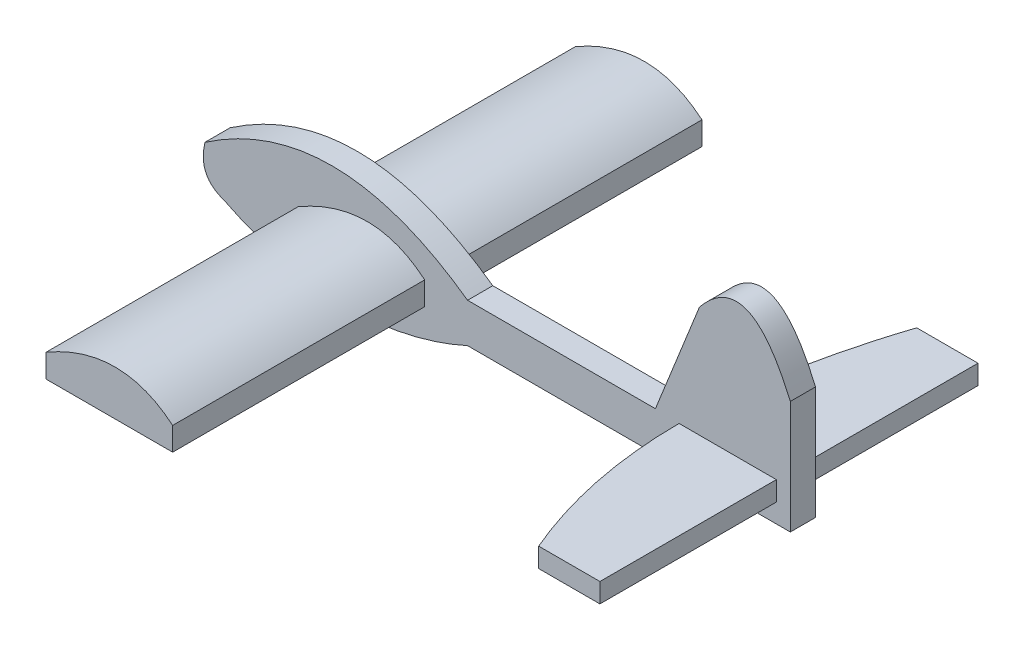
ISO-10303-21;
HEADER;
FILE_DESCRIPTION(('STEP AP214'),'2;1');
FILE_NAME('part.step','',(''),(''),'','','');
FILE_SCHEMA(('AUTOMOTIVE_DESIGN { 1 0 10303 214 1 1 1 1 }'));
ENDSEC;
DATA;
#1=APPLICATION_CONTEXT('core data for automotive mechanical design processes');
#2=APPLICATION_PROTOCOL_DEFINITION('international standard','automotive_design',2000,#1);
#3=PRODUCT_CONTEXT('',#1,'mechanical');
#4=PRODUCT('Part','Part','',(#3));
#5=PRODUCT_RELATED_PRODUCT_CATEGORY('part','',(#4));
#6=PRODUCT_DEFINITION_FORMATION('','',#4);
#7=PRODUCT_DEFINITION_CONTEXT('part definition',#1,'design');
#8=PRODUCT_DEFINITION('design','',#6,#7);
#9=PRODUCT_DEFINITION_SHAPE('','',#8);
#10=(LENGTH_UNIT() NAMED_UNIT(*) SI_UNIT(.MILLI.,.METRE.));
#11=(NAMED_UNIT(*) PLANE_ANGLE_UNIT() SI_UNIT($,.RADIAN.));
#12=(NAMED_UNIT(*) SI_UNIT($,.STERADIAN.) SOLID_ANGLE_UNIT());
#13=UNCERTAINTY_MEASURE_WITH_UNIT(LENGTH_MEASURE(1.E-05),#10,'distance_accuracy_value','');
#14=(GEOMETRIC_REPRESENTATION_CONTEXT(3) GLOBAL_UNCERTAINTY_ASSIGNED_CONTEXT((#13)) GLOBAL_UNIT_ASSIGNED_CONTEXT((#10,
#11,#12)) REPRESENTATION_CONTEXT('',''));
#15=CARTESIAN_POINT('',(0.,0.,0.));
#16=DIRECTION('',(0.,0.,1.));
#17=DIRECTION('',(1.,0.,0.));
#18=AXIS2_PLACEMENT_3D('',#15,#16,#17);
#19=CARTESIAN_POINT('',(0.,0.,-70.));
#20=DIRECTION('',(0.,0.,-1.));
#21=DIRECTION('',(-1.,0.,0.));
#22=AXIS2_PLACEMENT_3D('',#19,#20,#21);
#23=PLANE('',#22);
#24=DIRECTION('',(1.,0.,0.));
#25=VECTOR('',#24,1.);
#26=CARTESIAN_POINT('',(141.100668293864,2.62187148089209,-70.));
#27=LINE('',#26,#25);
#28=CARTESIAN_POINT('',(155.374228958421,2.62187148089209,-70.));
#29=VERTEX_POINT('',#28);
#30=CARTESIAN_POINT('',(179.686285603811,2.62187148089209,-70.));
#31=VERTEX_POINT('',#30);
#32=EDGE_CURVE('E683',#29,#31,#27,.T.);
#33=ORIENTED_EDGE('',*,*,#32,.F.);
#34=DIRECTION('',(0.,-1.,0.));
#35=VECTOR('',#34,1.);
#36=CARTESIAN_POINT('',(155.374228958421,433.104335244565,-70.));
#37=LINE('',#36,#35);
#38=CARTESIAN_POINT('',(155.374228958421,10.3389949428814,-70.));
#39=VERTEX_POINT('',#38);
#40=EDGE_CURVE('E55',#39,#29,#37,.T.);
#41=ORIENTED_EDGE('',*,*,#40,.F.);
#42=DIRECTION('',(1.,0.,0.));
#43=VECTOR('',#42,1.);
#44=CARTESIAN_POINT('',(141.100668293864,10.3389949428814,-70.));
#45=LINE('',#44,#43);
#46=CARTESIAN_POINT('',(179.686285603811,10.3389949428814,-70.));
#47=VERTEX_POINT('',#46);
#48=EDGE_CURVE('E215',#39,#47,#45,.T.);
#49=ORIENTED_EDGE('',*,*,#48,.T.);
#50=DIRECTION('',(0.,-1.,0.));
#51=VECTOR('',#50,1.);
#52=CARTESIAN_POINT('',(179.686285603811,10.3389949428814,-70.));
#53=LINE('',#52,#51);
#54=EDGE_CURVE('E685',#47,#31,#53,.T.);
#55=ORIENTED_EDGE('',*,*,#54,.T.);
#56=EDGE_LOOP('',(#33,#41,#49,#55));
#57=FACE_BOUND('',#56,.T.);
#58=ADVANCED_FACE('F37',(#57),#23,.T.);
#59=CARTESIAN_POINT('',(141.100668293864,10.3389949428814,-70.));
#60=DIRECTION('',(0.,-1.,0.));
#61=DIRECTION('',(0.,0.,-1.));
#62=AXIS2_PLACEMENT_3D('',#59,#60,#61);
#63=PLANE('',#62);
#64=CARTESIAN_POINT('',(141.100668293864,10.3389949428814,0.));
#65=CARTESIAN_POINT('',(144.111089710246,10.3389949428814,-35.9017036602863));
#66=CARTESIAN_POINT('',(155.374228958421,10.3389949428814,-70.));
#67=B_SPLINE_CURVE_WITH_KNOTS('',2,(#64,#65,#66),.UNSPECIFIED.,.F.,.F.,(3,3),(0.,1.),.UNSPECIFIED.);
#68=CARTESIAN_POINT('',(141.100668293864,10.3389949428814,0.));
#69=VERTEX_POINT('',#68);
#70=EDGE_CURVE('E201',#69,#39,#67,.T.);
#71=ORIENTED_EDGE('',*,*,#70,.F.);
#72=DIRECTION('',(-1.,0.,0.));
#73=VECTOR('',#72,1.);
#74=CARTESIAN_POINT('',(-46.6572760995504,10.3389949428814,0.));
#75=LINE('',#74,#73);
#76=CARTESIAN_POINT('',(179.686285603811,10.3389949428814,0.));
#77=VERTEX_POINT('',#76);
#78=EDGE_CURVE('E207',#77,#69,#75,.T.);
#79=ORIENTED_EDGE('',*,*,#78,.F.);
#80=DIRECTION('',(0.,0.,1.));
#81=VECTOR('',#80,1.);
#82=CARTESIAN_POINT('',(179.686285603811,10.3389949428814,-70.));
#83=LINE('',#82,#81);
#84=EDGE_CURVE('E690',#47,#77,#83,.T.);
#85=ORIENTED_EDGE('',*,*,#84,.F.);
#86=ORIENTED_EDGE('',*,*,#48,.F.);
#87=EDGE_LOOP('',(#71,#79,#85,#86));
#88=FACE_BOUND('',#87,.T.);
#89=ADVANCED_FACE('F212',(#88),#63,.F.);
#90=CARTESIAN_POINT('',(141.100668293864,2.62187148089209,-70.));
#91=DIRECTION('',(0.,-1.,0.));
#92=DIRECTION('',(0.,0.,-1.));
#93=AXIS2_PLACEMENT_3D('',#90,#91,#92);
#94=PLANE('',#93);
#95=DIRECTION('',(-1.,0.,0.));
#96=VECTOR('',#95,1.);
#97=CARTESIAN_POINT('',(-46.6572760995504,2.62187148089209,0.));
#98=LINE('',#97,#96);
#99=CARTESIAN_POINT('',(179.686285603811,2.62187148089209,0.));
#100=VERTEX_POINT('',#99);
#101=CARTESIAN_POINT('',(141.100668293864,2.6218714808921,0.));
#102=VERTEX_POINT('',#101);
#103=EDGE_CURVE('E206',#100,#102,#98,.T.);
#104=ORIENTED_EDGE('',*,*,#103,.T.);
#105=CARTESIAN_POINT('',(141.100668293864,2.6218714808921,0.));
#106=CARTESIAN_POINT('',(144.111089710246,2.6218714808921,-35.9017036602863));
#107=CARTESIAN_POINT('',(155.374228958421,2.6218714808921,-70.));
#108=B_SPLINE_CURVE_WITH_KNOTS('',2,(#105,#106,#107),.UNSPECIFIED.,.F.,.F.,(3,3),(0.,1.),.UNSPECIFIED.);
#109=EDGE_CURVE('E11',#102,#29,#108,.T.);
#110=ORIENTED_EDGE('',*,*,#109,.T.);
#111=ORIENTED_EDGE('',*,*,#32,.T.);
#112=DIRECTION('',(0.,0.,1.));
#113=VECTOR('',#112,1.);
#114=CARTESIAN_POINT('',(179.686285603811,2.62187148089209,-70.));
#115=LINE('',#114,#113);
#116=EDGE_CURVE('E694',#31,#100,#115,.T.);
#117=ORIENTED_EDGE('',*,*,#116,.T.);
#118=EDGE_LOOP('',(#104,#110,#111,#117));
#119=FACE_BOUND('',#118,.T.);
#120=ADVANCED_FACE('F399',(#119),#94,.T.);
#121=CARTESIAN_POINT('',(-46.6572760995504,2.6808031765581,10.));
#122=DIRECTION('',(0.,0.,-1.));
#123=DIRECTION('',(-1.,0.,0.));
#124=AXIS2_PLACEMENT_3D('',#121,#122,#123);
#125=PLANE('',#124);
#126=DIRECTION('',(-1.,0.,0.));
#127=VECTOR('',#126,1.);
#128=CARTESIAN_POINT('',(-46.6572760995504,2.62187148089209,10.));
#129=LINE('',#128,#127);
#130=CARTESIAN_POINT('',(179.686285603811,2.62187148089209,10.));
#131=VERTEX_POINT('',#130);
#132=CARTESIAN_POINT('',(141.100668293864,2.62187148089209,10.));
#133=VERTEX_POINT('',#132);
#134=EDGE_CURVE('E231',#131,#133,#129,.T.);
#135=ORIENTED_EDGE('',*,*,#134,.T.);
#136=DIRECTION('',(0.,1.,0.));
#137=VECTOR('',#136,1.);
#138=CARTESIAN_POINT('',(141.100668293864,2.6808031765581,10.));
#139=LINE('',#138,#137);
#140=CARTESIAN_POINT('',(141.100668293864,10.3389949428814,10.));
#141=VERTEX_POINT('',#140);
#142=EDGE_CURVE('E228',#133,#141,#139,.T.);
#143=ORIENTED_EDGE('',*,*,#142,.T.);
#144=DIRECTION('',(-1.,0.,0.));
#145=VECTOR('',#144,1.);
#146=CARTESIAN_POINT('',(-46.6572760995504,10.3389949428814,10.));
#147=LINE('',#146,#145);
#148=CARTESIAN_POINT('',(179.686285603811,10.3389949428814,9.99999999999999));
#149=VERTEX_POINT('',#148);
#150=EDGE_CURVE('E232',#149,#141,#147,.T.);
#151=ORIENTED_EDGE('',*,*,#150,.F.);
#152=DIRECTION('',(0.,1.,0.));
#153=VECTOR('',#152,1.);
#154=CARTESIAN_POINT('',(179.686285603811,2.6808031765581,10.));
#155=LINE('',#154,#153);
#156=EDGE_CURVE('E692',#131,#149,#155,.T.);
#157=ORIENTED_EDGE('',*,*,#156,.F.);
#158=EDGE_LOOP('',(#135,#143,#151,#157));
#159=FACE_BOUND('',#158,.T.);
#160=CARTESIAN_POINT('',(-47.0161730182278,12.8886034142632,10.));
#161=CARTESIAN_POINT('',(-49.9289716919331,0.460306463185123,10.));
#162=CARTESIAN_POINT('',(-39.7549879961077,-3.08600363440106,10.));
#163=B_SPLINE_CURVE_WITH_KNOTS('',2,(#160,#161,#162),.UNSPECIFIED.,.F.,.F.,(3,3),(0.,1.),.UNSPECIFIED.);
#164=CARTESIAN_POINT('',(-47.0161730182278,12.8886034142632,10.));
#165=VERTEX_POINT('',#164);
#166=CARTESIAN_POINT('',(-39.7549879961077,-3.08600363440106,10.));
#167=VERTEX_POINT('',#166);
#168=EDGE_CURVE('E315',#165,#167,#163,.T.);
#169=ORIENTED_EDGE('',*,*,#168,.T.);
#170=CARTESIAN_POINT('',(-39.7549879961077,-3.08600363440106,10.));
#171=CARTESIAN_POINT('',(8.1723074778826,-26.913609431055,10.));
#172=CARTESIAN_POINT('',(57.1818320491961,-4.9012998899311,10.));
#173=B_SPLINE_CURVE_WITH_KNOTS('',2,(#170,#171,#172),.UNSPECIFIED.,.F.,.F.,(3,3),(0.,1.),.UNSPECIFIED.);
#174=CARTESIAN_POINT('',(57.1818320491961,-4.9012998899311,10.));
#175=VERTEX_POINT('',#174);
#176=EDGE_CURVE('E321',#167,#175,#173,.T.);
#177=ORIENTED_EDGE('',*,*,#176,.T.);
#178=DIRECTION('',(1.,0.,0.));
#179=VECTOR('',#178,1.);
#180=CARTESIAN_POINT('',(57.1818320491961,-4.9012998899311,10.));
#181=LINE('',#180,#179);
#182=CARTESIAN_POINT('',(185.224129689331,-4.9012998899311,10.));
#183=VERTEX_POINT('',#182);
#184=EDGE_CURVE('E330',#175,#183,#181,.T.);
#185=ORIENTED_EDGE('',*,*,#184,.T.);
#186=DIRECTION('',(0.,1.,0.));
#187=VECTOR('',#186,1.);
#188=CARTESIAN_POINT('',(185.224129689331,39.9692174720236,10.));
#189=LINE('',#188,#187);
#190=CARTESIAN_POINT('',(185.224129689331,39.9692174720236,10.));
#191=VERTEX_POINT('',#190);
#192=EDGE_CURVE('E360',#183,#191,#189,.T.);
#193=ORIENTED_EDGE('',*,*,#192,.T.);
#194=CARTESIAN_POINT('',(185.224129689331,39.9692174720236,10.));
#195=CARTESIAN_POINT('',(168.827192519084,78.384539794946,10.));
#196=CARTESIAN_POINT('',(149.186074684106,54.3924654813716,10.));
#197=B_SPLINE_CURVE_WITH_KNOTS('',2,(#194,#195,#196),.UNSPECIFIED.,.F.,.F.,(3,3),(0.,1.),.UNSPECIFIED.);
#198=CARTESIAN_POINT('',(149.186074684106,54.3924654813716,10.));
#199=VERTEX_POINT('',#198);
#200=EDGE_CURVE('E354',#191,#199,#197,.T.);
#201=ORIENTED_EDGE('',*,*,#200,.T.);
#202=DIRECTION('',(-0.371568914717761,-0.928405375692895,0.));
#203=VECTOR('',#202,1.);
#204=CARTESIAN_POINT('',(131.703459221838,10.7102479076272,10.));
#205=LINE('',#204,#203);
#206=CARTESIAN_POINT('',(131.703459221838,10.7102479076272,10.));
#207=VERTEX_POINT('',#206);
#208=EDGE_CURVE('E359',#199,#207,#205,.T.);
#209=ORIENTED_EDGE('',*,*,#208,.T.);
#210=DIRECTION('',(-1.,0.,0.));
#211=VECTOR('',#210,1.);
#212=CARTESIAN_POINT('',(57.1818320491961,10.7102479076272,10.));
#213=LINE('',#212,#211);
#214=CARTESIAN_POINT('',(57.1818320491961,10.7102479076272,10.));
#215=VERTEX_POINT('',#214);
#216=EDGE_CURVE('E365',#207,#215,#213,.T.);
#217=ORIENTED_EDGE('',*,*,#216,.T.);
#218=CARTESIAN_POINT('',(57.1818320491961,10.7102479076272,10.));
#219=CARTESIAN_POINT('',(4.65403265798947,48.2199875504761,10.));
#220=CARTESIAN_POINT('',(-47.0161730182278,12.8886034142632,10.));
#221=B_SPLINE_CURVE_WITH_KNOTS('',2,(#218,#219,#220),.UNSPECIFIED.,.F.,.F.,(3,3),(0.,1.),.UNSPECIFIED.);
#222=EDGE_CURVE('E367',#215,#165,#221,.T.);
#223=ORIENTED_EDGE('',*,*,#222,.T.);
#224=EDGE_LOOP('',(#169,#177,#185,#193,#201,#209,#217,#223));
#225=FACE_BOUND('',#224,.T.);
#226=CARTESIAN_POINT('',(40.1772426595371,9.21342978922295,9.99999999999999));
#227=CARTESIAN_POINT('',(19.5228104609183,26.5260325184544,9.99999999999999));
#228=CARTESIAN_POINT('',(-10.072629783597,9.21342978922295,9.99999999999999));
#229=B_SPLINE_CURVE_WITH_KNOTS('',2,(#226,#227,#228),.UNSPECIFIED.,.F.,.F.,(3,3),(0.,1.),.UNSPECIFIED.);
#230=CARTESIAN_POINT('',(40.1772426595371,9.21342978922295,9.99999999999997));
#231=VERTEX_POINT('',#230);
#232=CARTESIAN_POINT('',(-10.072629783597,9.21342978922295,10.));
#233=VERTEX_POINT('',#232);
#234=EDGE_CURVE('E263',#231,#233,#229,.T.);
#235=ORIENTED_EDGE('',*,*,#234,.F.);
#236=DIRECTION('',(0.,-1.,0.));
#237=VECTOR('',#236,1.);
#238=CARTESIAN_POINT('',(40.1772426595371,2.6808031765581,10.));
#239=LINE('',#238,#237);
#240=CARTESIAN_POINT('',(40.1772426595371,0.,9.99999999999997));
#241=VERTEX_POINT('',#240);
#242=EDGE_CURVE('E312',#231,#241,#239,.T.);
#243=ORIENTED_EDGE('',*,*,#242,.T.);
#244=DIRECTION('',(-1.,0.,0.));
#245=VECTOR('',#244,1.);
#246=CARTESIAN_POINT('',(-46.6572760995504,0.,10.));
#247=LINE('',#246,#245);
#248=CARTESIAN_POINT('',(-10.072629783597,0.,9.99999999999997));
#249=VERTEX_POINT('',#248);
#250=EDGE_CURVE('E309',#241,#249,#247,.T.);
#251=ORIENTED_EDGE('',*,*,#250,.T.);
#252=DIRECTION('',(0.,1.,0.));
#253=VECTOR('',#252,1.);
#254=CARTESIAN_POINT('',(-10.072629783597,2.6808031765581,10.));
#255=LINE('',#254,#253);
#256=EDGE_CURVE('E295',#249,#233,#255,.T.);
#257=ORIENTED_EDGE('',*,*,#256,.T.);
#258=EDGE_LOOP('',(#235,#243,#251,#257));
#259=FACE_BOUND('',#258,.T.);
#260=ADVANCED_FACE('F416',(#159,#225,#259),#125,.F.);
#261=CARTESIAN_POINT('',(-46.6572760995504,2.6808031765581,0.));
#262=DIRECTION('',(0.,0.,-1.));
#263=DIRECTION('',(-1.,0.,0.));
#264=AXIS2_PLACEMENT_3D('',#261,#262,#263);
#265=PLANE('',#264);
#266=DIRECTION('',(0.,1.,0.));
#267=VECTOR('',#266,1.);
#268=CARTESIAN_POINT('',(141.100668293864,2.6808031765581,0.));
#269=LINE('',#268,#267);
#270=EDGE_CURVE('E198',#102,#69,#269,.T.);
#271=ORIENTED_EDGE('',*,*,#270,.F.);
#272=ORIENTED_EDGE('',*,*,#103,.F.);
#273=DIRECTION('',(0.,1.,0.));
#274=VECTOR('',#273,1.);
#275=CARTESIAN_POINT('',(179.686285603811,2.6808031765581,0.));
#276=LINE('',#275,#274);
#277=EDGE_CURVE('E220',#100,#77,#276,.T.);
#278=ORIENTED_EDGE('',*,*,#277,.T.);
#279=ORIENTED_EDGE('',*,*,#78,.T.);
#280=EDGE_LOOP('',(#271,#272,#278,#279));
#281=FACE_BOUND('',#280,.T.);
#282=DIRECTION('',(0.,1.,0.));
#283=VECTOR('',#282,1.);
#284=CARTESIAN_POINT('',(185.224129689331,39.9692174720236,0.));
#285=LINE('',#284,#283);
#286=CARTESIAN_POINT('',(185.224129689331,-4.9012998899311,0.));
#287=VERTEX_POINT('',#286);
#288=CARTESIAN_POINT('',(185.224129689331,39.9692174720236,0.));
#289=VERTEX_POINT('',#288);
#290=EDGE_CURVE('E739',#287,#289,#285,.T.);
#291=ORIENTED_EDGE('',*,*,#290,.F.);
#292=DIRECTION('',(1.,0.,0.));
#293=VECTOR('',#292,1.);
#294=CARTESIAN_POINT('',(57.1818320491961,-4.9012998899311,0.));
#295=LINE('',#294,#293);
#296=CARTESIAN_POINT('',(57.1818320491961,-4.9012998899311,0.));
#297=VERTEX_POINT('',#296);
#298=EDGE_CURVE('E736',#297,#287,#295,.T.);
#299=ORIENTED_EDGE('',*,*,#298,.F.);
#300=CARTESIAN_POINT('',(-39.7549879961077,-3.08600363440106,0.));
#301=CARTESIAN_POINT('',(8.1723074778826,-26.913609431055,0.));
#302=CARTESIAN_POINT('',(57.1818320491961,-4.9012998899311,0.));
#303=B_SPLINE_CURVE_WITH_KNOTS('',2,(#300,#301,#302),.UNSPECIFIED.,.F.,.F.,(3,3),(0.,1.),.UNSPECIFIED.);
#304=CARTESIAN_POINT('',(-39.7549879961077,-3.08600363440106,0.));
#305=VERTEX_POINT('',#304);
#306=EDGE_CURVE('E735',#305,#297,#303,.T.);
#307=ORIENTED_EDGE('',*,*,#306,.F.);
#308=CARTESIAN_POINT('',(-47.0161730182278,12.8886034142632,0.));
#309=CARTESIAN_POINT('',(-49.9289716919331,0.460306463185123,0.));
#310=CARTESIAN_POINT('',(-39.7549879961077,-3.08600363440106,0.));
#311=B_SPLINE_CURVE_WITH_KNOTS('',2,(#308,#309,#310),.UNSPECIFIED.,.F.,.F.,(3,3),(0.,1.),.UNSPECIFIED.);
#312=CARTESIAN_POINT('',(-47.0161730182278,12.8886034142632,0.));
#313=VERTEX_POINT('',#312);
#314=EDGE_CURVE('E314',#313,#305,#311,.T.);
#315=ORIENTED_EDGE('',*,*,#314,.F.);
#316=CARTESIAN_POINT('',(57.1818320491961,10.7102479076272,0.));
#317=CARTESIAN_POINT('',(4.65403265798947,48.2199875504761,0.));
#318=CARTESIAN_POINT('',(-47.0161730182278,12.8886034142632,0.));
#319=B_SPLINE_CURVE_WITH_KNOTS('',2,(#316,#317,#318),.UNSPECIFIED.,.F.,.F.,(3,3),(0.,1.),.UNSPECIFIED.);
#320=CARTESIAN_POINT('',(57.1818320491961,10.7102479076272,0.));
#321=VERTEX_POINT('',#320);
#322=EDGE_CURVE('E322',#321,#313,#319,.T.);
#323=ORIENTED_EDGE('',*,*,#322,.F.);
#324=DIRECTION('',(-1.,0.,0.));
#325=VECTOR('',#324,1.);
#326=CARTESIAN_POINT('',(57.1818320491961,10.7102479076272,0.));
#327=LINE('',#326,#325);
#328=CARTESIAN_POINT('',(131.703459221838,10.7102479076272,0.));
#329=VERTEX_POINT('',#328);
#330=EDGE_CURVE('E757',#329,#321,#327,.T.);
#331=ORIENTED_EDGE('',*,*,#330,.F.);
#332=DIRECTION('',(-0.371568914717761,-0.928405375692895,0.));
#333=VECTOR('',#332,1.);
#334=CARTESIAN_POINT('',(131.703459221838,10.7102479076272,0.));
#335=LINE('',#334,#333);
#336=CARTESIAN_POINT('',(149.186074684106,54.3924654813716,0.));
#337=VERTEX_POINT('',#336);
#338=EDGE_CURVE('E752',#337,#329,#335,.T.);
#339=ORIENTED_EDGE('',*,*,#338,.F.);
#340=CARTESIAN_POINT('',(185.224129689331,39.9692174720236,0.));
#341=CARTESIAN_POINT('',(168.827192519084,78.384539794946,0.));
#342=CARTESIAN_POINT('',(149.186074684106,54.3924654813716,0.));
#343=B_SPLINE_CURVE_WITH_KNOTS('',2,(#340,#341,#342),.UNSPECIFIED.,.F.,.F.,(3,3),(0.,1.),.UNSPECIFIED.);
#344=EDGE_CURVE('E748',#289,#337,#343,.T.);
#345=ORIENTED_EDGE('',*,*,#344,.F.);
#346=EDGE_LOOP('',(#291,#299,#307,#315,#323,#331,#339,#345));
#347=FACE_BOUND('',#346,.T.);
#348=DIRECTION('',(0.,-1.,0.));
#349=VECTOR('',#348,1.);
#350=CARTESIAN_POINT('',(40.1772426595371,2.6808031765581,0.));
#351=LINE('',#350,#349);
#352=CARTESIAN_POINT('',(40.1772426595371,9.21342978922295,0.));
#353=VERTEX_POINT('',#352);
#354=CARTESIAN_POINT('',(40.1772426595371,0.,0.));
#355=VERTEX_POINT('',#354);
#356=EDGE_CURVE('E222',#353,#355,#351,.T.);
#357=ORIENTED_EDGE('',*,*,#356,.F.);
#358=CARTESIAN_POINT('',(40.1772426595371,9.21342978922295,0.));
#359=CARTESIAN_POINT('',(19.5228104609183,26.5260325184544,0.));
#360=CARTESIAN_POINT('',(-10.072629783597,9.21342978922295,0.));
#361=B_SPLINE_CURVE_WITH_KNOTS('',2,(#358,#359,#360),.UNSPECIFIED.,.F.,.F.,(3,3),(0.,1.),.UNSPECIFIED.);
#362=CARTESIAN_POINT('',(-10.072629783597,9.21342978922295,0.));
#363=VERTEX_POINT('',#362);
#364=EDGE_CURVE('E248',#353,#363,#361,.T.);
#365=ORIENTED_EDGE('',*,*,#364,.T.);
#366=DIRECTION('',(0.,1.,0.));
#367=VECTOR('',#366,1.);
#368=CARTESIAN_POINT('',(-10.072629783597,2.6808031765581,0.));
#369=LINE('',#368,#367);
#370=CARTESIAN_POINT('',(-10.072629783597,0.,0.));
#371=VERTEX_POINT('',#370);
#372=EDGE_CURVE('E784',#371,#363,#369,.T.);
#373=ORIENTED_EDGE('',*,*,#372,.F.);
#374=DIRECTION('',(-1.,0.,0.));
#375=VECTOR('',#374,1.);
#376=CARTESIAN_POINT('',(-46.6572760995504,0.,0.));
#377=LINE('',#376,#375);
#378=EDGE_CURVE('E787',#355,#371,#377,.T.);
#379=ORIENTED_EDGE('',*,*,#378,.F.);
#380=EDGE_LOOP('',(#357,#365,#373,#379));
#381=FACE_BOUND('',#380,.T.);
#382=ADVANCED_FACE('F218',(#281,#347,#381),#265,.T.);
#383=DIRECTION('',(0.,0.,-1.));
#384=VECTOR('',#383,1.);
#385=SURFACE_OF_LINEAR_EXTRUSION('',#163,#384);
#386=ORIENTED_EDGE('',*,*,#314,.T.);
#387=DIRECTION('',(0.,0.,-1.));
#388=VECTOR('',#387,1.);
#389=CARTESIAN_POINT('',(-39.7549879961077,-3.08600363440106,10.));
#390=LINE('',#389,#388);
#391=EDGE_CURVE('E732',#167,#305,#390,.T.);
#392=ORIENTED_EDGE('',*,*,#391,.F.);
#393=ORIENTED_EDGE('',*,*,#168,.F.);
#394=DIRECTION('',(0.,0.,-1.));
#395=VECTOR('',#394,1.);
#396=CARTESIAN_POINT('',(-47.0161730182278,12.8886034142632,10.));
#397=LINE('',#396,#395);
#398=EDGE_CURVE('E372',#165,#313,#397,.T.);
#399=ORIENTED_EDGE('',*,*,#398,.T.);
#400=EDGE_LOOP('',(#386,#392,#393,#399));
#401=FACE_BOUND('',#400,.T.);
#402=ADVANCED_FACE('F39',(#401),#385,.F.);
#403=DIRECTION('',(0.,0.,-1.));
#404=VECTOR('',#403,1.);
#405=SURFACE_OF_LINEAR_EXTRUSION('',#173,#404);
#406=ORIENTED_EDGE('',*,*,#306,.T.);
#407=DIRECTION('',(0.,0.,-1.));
#408=VECTOR('',#407,1.);
#409=CARTESIAN_POINT('',(57.1818320491961,-4.9012998899311,10.));
#410=LINE('',#409,#408);
#411=EDGE_CURVE('E781',#175,#297,#410,.T.);
#412=ORIENTED_EDGE('',*,*,#411,.F.);
#413=ORIENTED_EDGE('',*,*,#176,.F.);
#414=ORIENTED_EDGE('',*,*,#391,.T.);
#415=EDGE_LOOP('',(#406,#412,#413,#414));
#416=FACE_BOUND('',#415,.T.);
#417=ADVANCED_FACE('F335',(#416),#405,.F.);
#418=CARTESIAN_POINT('',(57.1818320491961,-4.9012998899311,10.));
#419=DIRECTION('',(0.,1.,0.));
#420=DIRECTION('',(0.,0.,1.));
#421=AXIS2_PLACEMENT_3D('',#418,#419,#420);
#422=PLANE('',#421);
#423=ORIENTED_EDGE('',*,*,#298,.T.);
#424=DIRECTION('',(0.,0.,-1.));
#425=VECTOR('',#424,1.);
#426=CARTESIAN_POINT('',(185.224129689331,-4.9012998899311,10.));
#427=LINE('',#426,#425);
#428=EDGE_CURVE('E778',#183,#287,#427,.T.);
#429=ORIENTED_EDGE('',*,*,#428,.F.);
#430=ORIENTED_EDGE('',*,*,#184,.F.);
#431=ORIENTED_EDGE('',*,*,#411,.T.);
#432=EDGE_LOOP('',(#423,#429,#430,#431));
#433=FACE_BOUND('',#432,.T.);
#434=ADVANCED_FACE('F338',(#433),#422,.F.);
#435=CARTESIAN_POINT('',(185.224129689331,39.9692174720236,10.));
#436=DIRECTION('',(-1.,0.,0.));
#437=DIRECTION('',(0.,0.,1.));
#438=AXIS2_PLACEMENT_3D('',#435,#436,#437);
#439=PLANE('',#438);
#440=ORIENTED_EDGE('',*,*,#290,.T.);
#441=DIRECTION('',(0.,0.,-1.));
#442=VECTOR('',#441,1.);
#443=CARTESIAN_POINT('',(185.224129689331,39.9692174720236,10.));
#444=LINE('',#443,#442);
#445=EDGE_CURVE('E775',#191,#289,#444,.T.);
#446=ORIENTED_EDGE('',*,*,#445,.F.);
#447=ORIENTED_EDGE('',*,*,#192,.F.);
#448=ORIENTED_EDGE('',*,*,#428,.T.);
#449=EDGE_LOOP('',(#440,#446,#447,#448));
#450=FACE_BOUND('',#449,.T.);
#451=ADVANCED_FACE('F342',(#450),#439,.F.);
#452=DIRECTION('',(0.,0.,-1.));
#453=VECTOR('',#452,1.);
#454=SURFACE_OF_LINEAR_EXTRUSION('',#197,#453);
#455=ORIENTED_EDGE('',*,*,#344,.T.);
#456=DIRECTION('',(0.,0.,-1.));
#457=VECTOR('',#456,1.);
#458=CARTESIAN_POINT('',(149.186074684106,54.3924654813716,10.));
#459=LINE('',#458,#457);
#460=EDGE_CURVE('E772',#199,#337,#459,.T.);
#461=ORIENTED_EDGE('',*,*,#460,.F.);
#462=ORIENTED_EDGE('',*,*,#200,.F.);
#463=ORIENTED_EDGE('',*,*,#445,.T.);
#464=EDGE_LOOP('',(#455,#461,#462,#463));
#465=FACE_BOUND('',#464,.T.);
#466=ADVANCED_FACE('F346',(#465),#454,.F.);
#467=CARTESIAN_POINT('',(131.703459221838,10.7102479076272,10.));
#468=DIRECTION('',(0.928405375692895,-0.371568914717761,0.));
#469=DIRECTION('',(0.371568914717761,0.928405375692895,0.));
#470=AXIS2_PLACEMENT_3D('',#467,#468,#469);
#471=PLANE('',#470);
#472=ORIENTED_EDGE('',*,*,#338,.T.);
#473=DIRECTION('',(0.,0.,-1.));
#474=VECTOR('',#473,1.);
#475=CARTESIAN_POINT('',(131.703459221838,10.7102479076272,10.));
#476=LINE('',#475,#474);
#477=EDGE_CURVE('E769',#207,#329,#476,.T.);
#478=ORIENTED_EDGE('',*,*,#477,.F.);
#479=ORIENTED_EDGE('',*,*,#208,.F.);
#480=ORIENTED_EDGE('',*,*,#460,.T.);
#481=EDGE_LOOP('',(#472,#478,#479,#480));
#482=FACE_BOUND('',#481,.T.);
#483=ADVANCED_FACE('F351',(#482),#471,.F.);
#484=CARTESIAN_POINT('',(57.1818320491961,10.7102479076272,10.));
#485=DIRECTION('',(0.,-1.,0.));
#486=DIRECTION('',(0.,0.,-1.));
#487=AXIS2_PLACEMENT_3D('',#484,#485,#486);
#488=PLANE('',#487);
#489=ORIENTED_EDGE('',*,*,#330,.T.);
#490=DIRECTION('',(0.,0.,-1.));
#491=VECTOR('',#490,1.);
#492=CARTESIAN_POINT('',(57.1818320491961,10.7102479076272,10.));
#493=LINE('',#492,#491);
#494=EDGE_CURVE('E766',#215,#321,#493,.T.);
#495=ORIENTED_EDGE('',*,*,#494,.F.);
#496=ORIENTED_EDGE('',*,*,#216,.F.);
#497=ORIENTED_EDGE('',*,*,#477,.T.);
#498=EDGE_LOOP('',(#489,#495,#496,#497));
#499=FACE_BOUND('',#498,.T.);
#500=ADVANCED_FACE('F384',(#499),#488,.F.);
#501=DIRECTION('',(0.,0.,-1.));
#502=VECTOR('',#501,1.);
#503=SURFACE_OF_LINEAR_EXTRUSION('',#221,#502);
#504=ORIENTED_EDGE('',*,*,#322,.T.);
#505=ORIENTED_EDGE('',*,*,#398,.F.);
#506=ORIENTED_EDGE('',*,*,#222,.F.);
#507=ORIENTED_EDGE('',*,*,#494,.T.);
#508=EDGE_LOOP('',(#504,#505,#506,#507));
#509=FACE_BOUND('',#508,.T.);
#510=ADVANCED_FACE('F380',(#509),#503,.F.);
#511=CARTESIAN_POINT('',(0.,0.,-100.));
#512=DIRECTION('',(0.,0.,1.));
#513=DIRECTION('',(1.,0.,0.));
#514=AXIS2_PLACEMENT_3D('',#511,#512,#513);
#515=PLANE('',#514);
#516=DIRECTION('',(0.,-1.,0.));
#517=VECTOR('',#516,1.);
#518=CARTESIAN_POINT('',(-10.072629783597,9.21342978922295,-100.));
#519=LINE('',#518,#517);
#520=CARTESIAN_POINT('',(-10.072629783597,9.21342978922295,-100.));
#521=VERTEX_POINT('',#520);
#522=CARTESIAN_POINT('',(-10.072629783597,0.,-100.));
#523=VERTEX_POINT('',#522);
#524=EDGE_CURVE('E283',#521,#523,#519,.T.);
#525=ORIENTED_EDGE('',*,*,#524,.F.);
#526=CARTESIAN_POINT('',(40.1772426595371,9.21342978922295,-100.));
#527=CARTESIAN_POINT('',(19.5228104609183,26.5260325184544,-100.));
#528=CARTESIAN_POINT('',(-10.072629783597,9.21342978922295,-100.));
#529=B_SPLINE_CURVE_WITH_KNOTS('',2,(#526,#527,#528),.UNSPECIFIED.,.F.,.F.,(3,3),(0.,1.),.UNSPECIFIED.);
#530=CARTESIAN_POINT('',(40.1772426595371,9.21342978922295,-100.));
#531=VERTEX_POINT('',#530);
#532=EDGE_CURVE('E236',#531,#521,#529,.T.);
#533=ORIENTED_EDGE('',*,*,#532,.F.);
#534=DIRECTION('',(0.,1.,0.));
#535=VECTOR('',#534,1.);
#536=CARTESIAN_POINT('',(40.1772426595371,0.,-100.));
#537=LINE('',#536,#535);
#538=CARTESIAN_POINT('',(40.1772426595371,0.,-100.));
#539=VERTEX_POINT('',#538);
#540=EDGE_CURVE('E289',#539,#531,#537,.T.);
#541=ORIENTED_EDGE('',*,*,#540,.F.);
#542=DIRECTION('',(1.,0.,0.));
#543=VECTOR('',#542,1.);
#544=CARTESIAN_POINT('',(-10.072629783597,0.,-100.));
#545=LINE('',#544,#543);
#546=EDGE_CURVE('E286',#523,#539,#545,.T.);
#547=ORIENTED_EDGE('',*,*,#546,.F.);
#548=EDGE_LOOP('',(#525,#533,#541,#547));
#549=FACE_BOUND('',#548,.T.);
#550=ADVANCED_FACE('F383',(#549),#515,.F.);
#551=CARTESIAN_POINT('',(-10.072629783597,9.21342978922295,-100.));
#552=DIRECTION('',(-1.,0.,0.));
#553=DIRECTION('',(0.,0.,1.));
#554=AXIS2_PLACEMENT_3D('',#551,#552,#553);
#555=PLANE('',#554);
#556=DIRECTION('',(0.,0.,1.));
#557=VECTOR('',#556,1.);
#558=CARTESIAN_POINT('',(-10.072629783597,0.,-100.));
#559=LINE('',#558,#557);
#560=EDGE_CURVE('E301',#523,#371,#559,.T.);
#561=ORIENTED_EDGE('',*,*,#560,.T.);
#562=ORIENTED_EDGE('',*,*,#372,.T.);
#563=DIRECTION('',(0.,0.,1.));
#564=VECTOR('',#563,1.);
#565=CARTESIAN_POINT('',(-10.072629783597,9.21342978922295,-100.));
#566=LINE('',#565,#564);
#567=EDGE_CURVE('E305',#521,#363,#566,.T.);
#568=ORIENTED_EDGE('',*,*,#567,.F.);
#569=ORIENTED_EDGE('',*,*,#524,.T.);
#570=EDGE_LOOP('',(#561,#562,#568,#569));
#571=FACE_BOUND('',#570,.T.);
#572=ADVANCED_FACE('F428',(#571),#555,.T.);
#573=CARTESIAN_POINT('',(-10.072629783597,0.,-100.));
#574=DIRECTION('',(0.,-1.,0.));
#575=DIRECTION('',(0.,0.,-1.));
#576=AXIS2_PLACEMENT_3D('',#573,#574,#575);
#577=PLANE('',#576);
#578=DIRECTION('',(0.,0.,1.));
#579=VECTOR('',#578,1.);
#580=CARTESIAN_POINT('',(40.1772426595371,0.,-100.));
#581=LINE('',#580,#579);
#582=EDGE_CURVE('E297',#539,#355,#581,.T.);
#583=ORIENTED_EDGE('',*,*,#582,.T.);
#584=ORIENTED_EDGE('',*,*,#378,.T.);
#585=ORIENTED_EDGE('',*,*,#560,.F.);
#586=ORIENTED_EDGE('',*,*,#546,.T.);
#587=EDGE_LOOP('',(#583,#584,#585,#586));
#588=FACE_BOUND('',#587,.T.);
#589=ADVANCED_FACE('F434',(#588),#577,.T.);
#590=CARTESIAN_POINT('',(40.1772426595371,0.,-100.));
#591=DIRECTION('',(1.,0.,0.));
#592=DIRECTION('',(0.,0.,-1.));
#593=AXIS2_PLACEMENT_3D('',#590,#591,#592);
#594=PLANE('',#593);
#595=DIRECTION('',(0.,0.,1.));
#596=VECTOR('',#595,1.);
#597=CARTESIAN_POINT('',(40.1772426595371,9.21342978922295,-100.));
#598=LINE('',#597,#596);
#599=EDGE_CURVE('E292',#531,#353,#598,.T.);
#600=ORIENTED_EDGE('',*,*,#599,.T.);
#601=ORIENTED_EDGE('',*,*,#356,.T.);
#602=ORIENTED_EDGE('',*,*,#582,.F.);
#603=ORIENTED_EDGE('',*,*,#540,.T.);
#604=EDGE_LOOP('',(#600,#601,#602,#603));
#605=FACE_BOUND('',#604,.T.);
#606=ADVANCED_FACE('F430',(#605),#594,.T.);
#607=ORIENTED_EDGE('',*,*,#242,.F.);
#608=CARTESIAN_POINT('',(40.1772426595371,9.21342978922295,110.));
#609=VERTEX_POINT('',#608);
#610=EDGE_CURVE('E296',#231,#609,#598,.T.);
#611=ORIENTED_EDGE('',*,*,#610,.T.);
#612=DIRECTION('',(0.,1.,0.));
#613=VECTOR('',#612,1.);
#614=CARTESIAN_POINT('',(40.1772426595371,0.,110.));
#615=LINE('',#614,#613);
#616=CARTESIAN_POINT('',(40.1772426595371,0.,110.));
#617=VERTEX_POINT('',#616);
#618=EDGE_CURVE('E280',#617,#609,#615,.T.);
#619=ORIENTED_EDGE('',*,*,#618,.F.);
#620=EDGE_CURVE('E300',#241,#617,#581,.T.);
#621=ORIENTED_EDGE('',*,*,#620,.F.);
#622=EDGE_LOOP('',(#607,#611,#619,#621));
#623=FACE_BOUND('',#622,.T.);
#624=ADVANCED_FACE('F433',(#623),#594,.T.);
#625=ORIENTED_EDGE('',*,*,#250,.F.);
#626=ORIENTED_EDGE('',*,*,#620,.T.);
#627=DIRECTION('',(1.,0.,0.));
#628=VECTOR('',#627,1.);
#629=CARTESIAN_POINT('',(-10.072629783597,0.,110.));
#630=LINE('',#629,#628);
#631=CARTESIAN_POINT('',(-10.072629783597,0.,110.));
#632=VERTEX_POINT('',#631);
#633=EDGE_CURVE('E277',#632,#617,#630,.T.);
#634=ORIENTED_EDGE('',*,*,#633,.F.);
#635=EDGE_CURVE('E304',#249,#632,#559,.T.);
#636=ORIENTED_EDGE('',*,*,#635,.F.);
#637=EDGE_LOOP('',(#625,#626,#634,#636));
#638=FACE_BOUND('',#637,.T.);
#639=ADVANCED_FACE('F439',(#638),#577,.T.);
#640=ORIENTED_EDGE('',*,*,#256,.F.);
#641=ORIENTED_EDGE('',*,*,#635,.T.);
#642=DIRECTION('',(0.,-1.,0.));
#643=VECTOR('',#642,1.);
#644=CARTESIAN_POINT('',(-10.072629783597,9.21342978922295,110.));
#645=LINE('',#644,#643);
#646=CARTESIAN_POINT('',(-10.072629783597,9.21342978922295,110.));
#647=VERTEX_POINT('',#646);
#648=EDGE_CURVE('E271',#647,#632,#645,.T.);
#649=ORIENTED_EDGE('',*,*,#648,.F.);
#650=EDGE_CURVE('E291',#233,#647,#566,.T.);
#651=ORIENTED_EDGE('',*,*,#650,.F.);
#652=EDGE_LOOP('',(#640,#641,#649,#651));
#653=FACE_BOUND('',#652,.T.);
#654=ADVANCED_FACE('F424',(#653),#555,.T.);
#655=CARTESIAN_POINT('',(0.,0.,110.));
#656=DIRECTION('',(0.,0.,1.));
#657=DIRECTION('',(1.,0.,0.));
#658=AXIS2_PLACEMENT_3D('',#655,#656,#657);
#659=PLANE('',#658);
#660=ORIENTED_EDGE('',*,*,#618,.T.);
#661=CARTESIAN_POINT('',(40.1772426595371,9.21342978922295,110.));
#662=CARTESIAN_POINT('',(19.5228104609183,26.5260325184544,110.));
#663=CARTESIAN_POINT('',(-10.072629783597,9.21342978922295,110.));
#664=B_SPLINE_CURVE_WITH_KNOTS('',2,(#661,#662,#663),.UNSPECIFIED.,.F.,.F.,(3,3),(0.,1.),.UNSPECIFIED.);
#665=EDGE_CURVE('E241',#609,#647,#664,.T.);
#666=ORIENTED_EDGE('',*,*,#665,.T.);
#667=ORIENTED_EDGE('',*,*,#648,.T.);
#668=ORIENTED_EDGE('',*,*,#633,.T.);
#669=EDGE_LOOP('',(#660,#666,#667,#668));
#670=FACE_BOUND('',#669,.T.);
#671=ADVANCED_FACE('F421',(#670),#659,.T.);
#672=DIRECTION('',(0.,0.,-1.));
#673=VECTOR('',#672,1.);
#674=SURFACE_OF_LINEAR_EXTRUSION('',#664,#673);
#675=ORIENTED_EDGE('',*,*,#610,.F.);
#676=ORIENTED_EDGE('',*,*,#234,.T.);
#677=ORIENTED_EDGE('',*,*,#650,.T.);
#678=ORIENTED_EDGE('',*,*,#665,.F.);
#679=EDGE_LOOP('',(#675,#676,#677,#678));
#680=FACE_BOUND('',#679,.T.);
#681=ADVANCED_FACE('F420',(#680),#674,.F.);
#682=ORIENTED_EDGE('',*,*,#364,.F.);
#683=ORIENTED_EDGE('',*,*,#599,.F.);
#684=ORIENTED_EDGE('',*,*,#532,.T.);
#685=ORIENTED_EDGE('',*,*,#567,.T.);
#686=EDGE_LOOP('',(#682,#683,#684,#685));
#687=FACE_BOUND('',#686,.T.);
#688=ADVANCED_FACE('F411',(#687),#674,.F.);
#689=CARTESIAN_POINT('',(179.686285603811,10.3389949428814,-70.));
#690=DIRECTION('',(-1.,0.,0.));
#691=DIRECTION('',(0.,0.,1.));
#692=AXIS2_PLACEMENT_3D('',#689,#690,#691);
#693=PLANE('',#692);
#694=ORIENTED_EDGE('',*,*,#277,.F.);
#695=ORIENTED_EDGE('',*,*,#116,.F.);
#696=ORIENTED_EDGE('',*,*,#54,.F.);
#697=ORIENTED_EDGE('',*,*,#84,.T.);
#698=EDGE_LOOP('',(#694,#695,#696,#697));
#699=FACE_BOUND('',#698,.T.);
#700=ADVANCED_FACE('F407',(#699),#693,.F.);
#701=CARTESIAN_POINT('',(155.374228958421,2.62187148089209,80.));
#702=CARTESIAN_POINT('',(141.156131378623,2.62187148089209,46.554762938191));
#703=CARTESIAN_POINT('',(141.100668293864,2.62187148089209,10.));
#704=B_SPLINE_CURVE_WITH_KNOTS('',2,(#701,#702,#703),.UNSPECIFIED.,.F.,.F.,(3,3),(0.,1.),.UNSPECIFIED.);
#705=CARTESIAN_POINT('',(155.374228958421,2.62187148089209,80.));
#706=VERTEX_POINT('',#705);
#707=EDGE_CURVE('E62',#133,#706,#704,.F.);
#708=ORIENTED_EDGE('',*,*,#707,.F.);
#709=ORIENTED_EDGE('',*,*,#134,.F.);
#710=CARTESIAN_POINT('',(179.686285603811,2.62187148089209,80.));
#711=VERTEX_POINT('',#710);
#712=EDGE_CURVE('E689',#131,#711,#115,.T.);
#713=ORIENTED_EDGE('',*,*,#712,.T.);
#714=DIRECTION('',(1.,0.,0.));
#715=VECTOR('',#714,1.);
#716=CARTESIAN_POINT('',(141.100668293864,2.62187148089209,80.));
#717=LINE('',#716,#715);
#718=EDGE_CURVE('E663',#706,#711,#717,.T.);
#719=ORIENTED_EDGE('',*,*,#718,.F.);
#720=EDGE_LOOP('',(#708,#709,#713,#719));
#721=FACE_BOUND('',#720,.T.);
#722=ADVANCED_FACE('F410',(#721),#94,.T.);
#723=ORIENTED_EDGE('',*,*,#150,.T.);
#724=CARTESIAN_POINT('',(155.374228958421,10.3389949428814,80.));
#725=CARTESIAN_POINT('',(141.156131378623,10.3389949428814,46.554762938191));
#726=CARTESIAN_POINT('',(141.100668293864,10.3389949428814,10.));
#727=B_SPLINE_CURVE_WITH_KNOTS('',2,(#724,#725,#726),.UNSPECIFIED.,.F.,.F.,(3,3),(0.,1.),.UNSPECIFIED.);
#728=CARTESIAN_POINT('',(155.374228958421,10.3389949428814,80.));
#729=VERTEX_POINT('',#728);
#730=EDGE_CURVE('E216',#729,#141,#727,.T.);
#731=ORIENTED_EDGE('',*,*,#730,.F.);
#732=DIRECTION('',(1.,0.,0.));
#733=VECTOR('',#732,1.);
#734=CARTESIAN_POINT('',(141.100668293864,10.3389949428814,80.));
#735=LINE('',#734,#733);
#736=CARTESIAN_POINT('',(179.686285603811,10.3389949428814,80.));
#737=VERTEX_POINT('',#736);
#738=EDGE_CURVE('E681',#729,#737,#735,.T.);
#739=ORIENTED_EDGE('',*,*,#738,.T.);
#740=EDGE_CURVE('E693',#149,#737,#83,.T.);
#741=ORIENTED_EDGE('',*,*,#740,.F.);
#742=EDGE_LOOP('',(#723,#731,#739,#741));
#743=FACE_BOUND('',#742,.T.);
#744=ADVANCED_FACE('F401',(#743),#63,.F.);
#745=ORIENTED_EDGE('',*,*,#712,.F.);
#746=ORIENTED_EDGE('',*,*,#156,.T.);
#747=ORIENTED_EDGE('',*,*,#740,.T.);
#748=DIRECTION('',(0.,-1.,0.));
#749=VECTOR('',#748,1.);
#750=CARTESIAN_POINT('',(179.686285603811,10.3389949428814,80.));
#751=LINE('',#750,#749);
#752=EDGE_CURVE('E665',#737,#711,#751,.T.);
#753=ORIENTED_EDGE('',*,*,#752,.T.);
#754=EDGE_LOOP('',(#745,#746,#747,#753));
#755=FACE_BOUND('',#754,.T.);
#756=ADVANCED_FACE('F413',(#755),#693,.F.);
#757=CARTESIAN_POINT('',(0.,0.,80.));
#758=DIRECTION('',(0.,0.,-1.));
#759=DIRECTION('',(-1.,0.,0.));
#760=AXIS2_PLACEMENT_3D('',#757,#758,#759);
#761=PLANE('',#760);
#762=ORIENTED_EDGE('',*,*,#738,.F.);
#763=DIRECTION('',(0.,1.,0.));
#764=VECTOR('',#763,1.);
#765=CARTESIAN_POINT('',(155.374228958421,-59.6610050571186,80.));
#766=LINE('',#765,#764);
#767=EDGE_CURVE('E48',#729,#706,#766,.F.);
#768=ORIENTED_EDGE('',*,*,#767,.T.);
#769=ORIENTED_EDGE('',*,*,#718,.T.);
#770=ORIENTED_EDGE('',*,*,#752,.F.);
#771=EDGE_LOOP('',(#762,#768,#769,#770));
#772=FACE_BOUND('',#771,.T.);
#773=ADVANCED_FACE('F404',(#772),#761,.F.);
#774=CARTESIAN_POINT('',(155.374228958421,-59.6610050571186,80.));
#775=CARTESIAN_POINT('',(141.156131378623,-59.6610050571186,46.554762938191));
#776=CARTESIAN_POINT('',(141.100668293864,-59.6610050571186,10.));
#777=B_SPLINE_CURVE_WITH_KNOTS('',2,(#774,#775,#776),.UNSPECIFIED.,.F.,.F.,(3,3),(0.,1.),.UNSPECIFIED.);
#778=DIRECTION('',(0.,1.,0.));
#779=VECTOR('',#778,1.);
#780=SURFACE_OF_LINEAR_EXTRUSION('',#777,#779);
#781=ORIENTED_EDGE('',*,*,#707,.T.);
#782=ORIENTED_EDGE('',*,*,#767,.F.);
#783=ORIENTED_EDGE('',*,*,#730,.T.);
#784=ORIENTED_EDGE('',*,*,#142,.F.);
#785=EDGE_LOOP('',(#781,#782,#783,#784));
#786=FACE_BOUND('',#785,.T.);
#787=ADVANCED_FACE('F554',(#786),#780,.F.);
#788=CARTESIAN_POINT('',(141.100668293864,433.104335244565,0.));
#789=CARTESIAN_POINT('',(144.111089710246,433.104335244565,-35.9017036602863));
#790=CARTESIAN_POINT('',(155.374228958421,433.104335244565,-70.));
#791=B_SPLINE_CURVE_WITH_KNOTS('',2,(#788,#789,#790),.UNSPECIFIED.,.F.,.F.,(3,3),(0.,1.),.UNSPECIFIED.);
#792=DIRECTION('',(0.,-1.,0.));
#793=VECTOR('',#792,1.);
#794=SURFACE_OF_LINEAR_EXTRUSION('',#791,#793);
#795=ORIENTED_EDGE('',*,*,#270,.T.);
#796=ORIENTED_EDGE('',*,*,#70,.T.);
#797=ORIENTED_EDGE('',*,*,#40,.T.);
#798=ORIENTED_EDGE('',*,*,#109,.F.);
#799=EDGE_LOOP('',(#795,#796,#797,#798));
#800=FACE_BOUND('',#799,.T.);
#801=ADVANCED_FACE('F200',(#800),#794,.T.);
#802=CLOSED_SHELL('',(#58,#89,#120,#260,#382,#402,#417,#434,#451,#466,#483,#500,#510,#550,#572,
#589,#606,#624,#639,#654,#671,#681,#688,#700,#722,#744,#756,#773,#787,#801));
#803=MANIFOLD_SOLID_BREP('B2',#802);
#804=ADVANCED_BREP_SHAPE_REPRESENTATION('',(#18,#803),#14);
#805=SHAPE_DEFINITION_REPRESENTATION(#9,#804);
ENDSEC;
END-ISO-10303-21;
